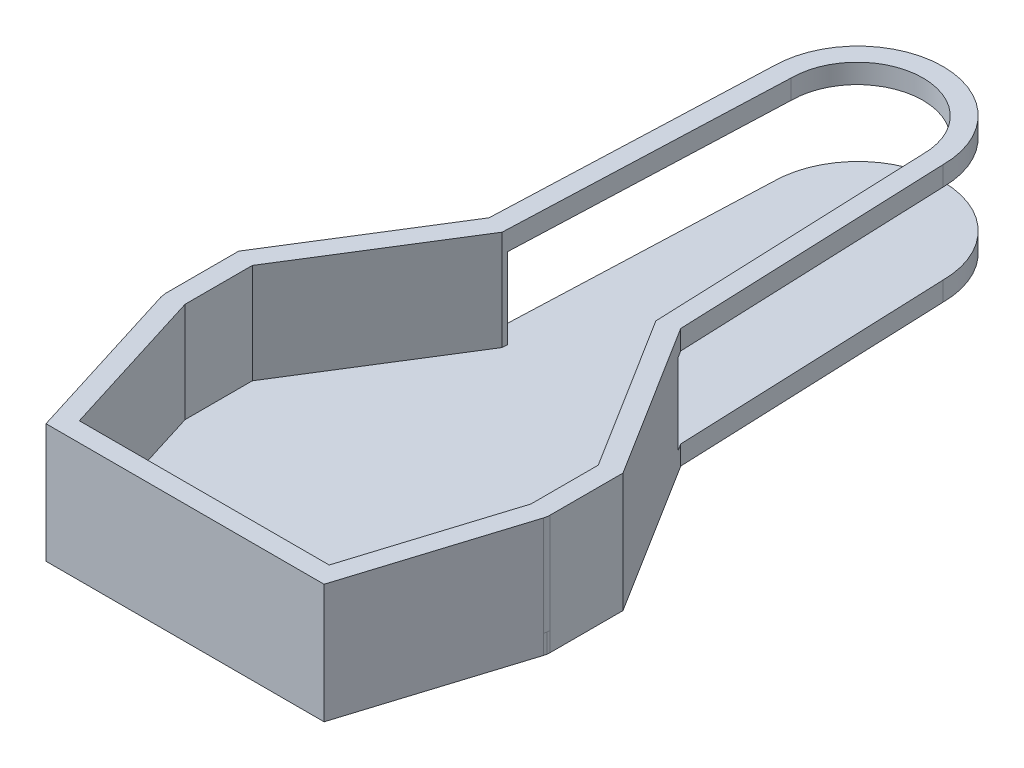
ISO-10303-21;
HEADER;
FILE_DESCRIPTION(('STEP AP214'),'2;1');
FILE_NAME('part.step','',(''),(''),'','','');
FILE_SCHEMA(('AUTOMOTIVE_DESIGN { 1 0 10303 214 1 1 1 1 }'));
ENDSEC;
DATA;
#1=APPLICATION_CONTEXT('core data for automotive mechanical design processes');
#2=APPLICATION_PROTOCOL_DEFINITION('international standard','automotive_design',2000,#1);
#3=PRODUCT_CONTEXT('',#1,'mechanical');
#4=PRODUCT('Part','Part','',(#3));
#5=PRODUCT_RELATED_PRODUCT_CATEGORY('part','',(#4));
#6=PRODUCT_DEFINITION_FORMATION('','',#4);
#7=PRODUCT_DEFINITION_CONTEXT('part definition',#1,'design');
#8=PRODUCT_DEFINITION('design','',#6,#7);
#9=PRODUCT_DEFINITION_SHAPE('','',#8);
#10=(LENGTH_UNIT() NAMED_UNIT(*) SI_UNIT(.MILLI.,.METRE.));
#11=(NAMED_UNIT(*) PLANE_ANGLE_UNIT() SI_UNIT($,.RADIAN.));
#12=(NAMED_UNIT(*) SI_UNIT($,.STERADIAN.) SOLID_ANGLE_UNIT());
#13=UNCERTAINTY_MEASURE_WITH_UNIT(LENGTH_MEASURE(1.E-05),#10,'distance_accuracy_value','');
#14=(GEOMETRIC_REPRESENTATION_CONTEXT(3) GLOBAL_UNCERTAINTY_ASSIGNED_CONTEXT((#13)) GLOBAL_UNIT_ASSIGNED_CONTEXT((#10,
#11,#12)) REPRESENTATION_CONTEXT('',''));
#15=CARTESIAN_POINT('',(0.,0.,0.));
#16=DIRECTION('',(0.,0.,1.));
#17=DIRECTION('',(1.,0.,0.));
#18=AXIS2_PLACEMENT_3D('',#15,#16,#17);
#19=CARTESIAN_POINT('',(41.2789167381474,33.02,-215.965853578591));
#20=DIRECTION('',(0.,-1.,0.));
#21=DIRECTION('',(0.,0.,-1.));
#22=AXIS2_PLACEMENT_3D('',#19,#20,#21);
#23=CYLINDRICAL_SURFACE('',#22,28.1239344626758);
#24=DIRECTION('',(0.,-1.,0.));
#25=VECTOR('',#24,1.);
#26=CARTESIAN_POINT('',(13.1549822754717,33.02,-215.965853578591));
#27=LINE('',#26,#25);
#28=CARTESIAN_POINT('',(13.1549822754717,0.,-215.965853578591));
#29=VERTEX_POINT('',#28);
#30=CARTESIAN_POINT('',(13.1549822754717,-6.35,-215.965853578591));
#31=VERTEX_POINT('',#30);
#32=EDGE_CURVE('E482',#29,#31,#27,.T.);
#33=ORIENTED_EDGE('',*,*,#32,.F.);
#34=CARTESIAN_POINT('',(41.2789167381474,0.,-215.965853578591));
#35=DIRECTION('',(0.,1.,0.));
#36=DIRECTION('',(0.,0.,1.));
#37=AXIS2_PLACEMENT_3D('',#34,#35,#36);
#38=CIRCLE('',#37,28.1239344626758);
#39=CARTESIAN_POINT('',(69.4028512008232,0.,-215.965853578591));
#40=VERTEX_POINT('',#39);
#41=EDGE_CURVE('E245',#29,#40,#38,.F.);
#42=ORIENTED_EDGE('',*,*,#41,.T.);
#43=DIRECTION('',(0.,-1.,0.));
#44=VECTOR('',#43,1.);
#45=CARTESIAN_POINT('',(69.4028512008232,33.02,-215.965853578591));
#46=LINE('',#45,#44);
#47=CARTESIAN_POINT('',(69.4028512008232,-6.35,-215.965853578591));
#48=VERTEX_POINT('',#47);
#49=EDGE_CURVE('E407',#40,#48,#46,.T.);
#50=ORIENTED_EDGE('',*,*,#49,.T.);
#51=CARTESIAN_POINT('',(41.2789167381474,-6.35,-215.965853578591));
#52=DIRECTION('',(0.,-1.,0.));
#53=DIRECTION('',(0.,0.,-1.));
#54=AXIS2_PLACEMENT_3D('',#51,#52,#53);
#55=CIRCLE('',#54,28.1239344626758);
#56=EDGE_CURVE('E325',#31,#48,#55,.T.);
#57=ORIENTED_EDGE('',*,*,#56,.F.);
#58=EDGE_LOOP('',(#33,#42,#50,#57));
#59=FACE_BOUND('',#58,.T.);
#60=ADVANCED_FACE('F35',(#59),#23,.T.);
#61=CARTESIAN_POINT('',(4.63721586896624,33.02,0.182738740625529));
#62=DIRECTION('',(-0.999224447545275,0.,-0.0393764323909659));
#63=DIRECTION('',(-0.0393764323909659,0.,0.999224447545275));
#64=AXIS2_PLACEMENT_3D('',#61,#62,#63);
#65=PLANE('',#64);
#66=DIRECTION('',(0.,-1.,0.));
#67=VECTOR('',#66,1.);
#68=CARTESIAN_POINT('',(9.60025223164843,33.02,-125.760292827314));
#69=LINE('',#68,#67);
#70=CARTESIAN_POINT('',(9.60025223164841,0.,-125.760292827313));
#71=VERTEX_POINT('',#70);
#72=CARTESIAN_POINT('',(9.60025223164845,-6.35,-125.760292827314));
#73=VERTEX_POINT('',#72);
#74=EDGE_CURVE('E259',#71,#73,#69,.T.);
#75=ORIENTED_EDGE('',*,*,#74,.F.);
#76=DIRECTION('',(0.0393764323909659,0.,-0.999224447545275));
#77=VECTOR('',#76,1.);
#78=CARTESIAN_POINT('',(4.63721586896624,0.,0.182738740625529));
#79=LINE('',#78,#77);
#80=EDGE_CURVE('E238',#71,#29,#79,.T.);
#81=ORIENTED_EDGE('',*,*,#80,.T.);
#82=ORIENTED_EDGE('',*,*,#32,.T.);
#83=DIRECTION('',(0.0393764323909659,0.,-0.999224447545275));
#84=VECTOR('',#83,1.);
#85=CARTESIAN_POINT('',(4.63721586896624,-6.35,0.182738740625529));
#86=LINE('',#85,#84);
#87=EDGE_CURVE('E262',#73,#31,#86,.T.);
#88=ORIENTED_EDGE('',*,*,#87,.F.);
#89=EDGE_LOOP('',(#75,#81,#82,#88));
#90=FACE_BOUND('',#89,.T.);
#91=ADVANCED_FACE('F260',(#90),#65,.T.);
#92=CARTESIAN_POINT('',(77.7926114035286,33.02,-3.06557301612554));
#93=DIRECTION('',(0.999224447545275,0.,-0.0393764323909661));
#94=DIRECTION('',(-0.0393764323909661,0.,-0.999224447545275));
#95=AXIS2_PLACEMENT_3D('',#92,#93,#94);
#96=PLANE('',#95);
#97=ORIENTED_EDGE('',*,*,#49,.F.);
#98=DIRECTION('',(0.0393764323909661,0.,0.999224447545275));
#99=VECTOR('',#98,1.);
#100=CARTESIAN_POINT('',(77.7926114035286,0.,-3.06557301612554));
#101=LINE('',#100,#99);
#102=CARTESIAN_POINT('',(72.9575812446464,0.,-125.760292827313));
#103=VERTEX_POINT('',#102);
#104=EDGE_CURVE('E276',#40,#103,#101,.T.);
#105=ORIENTED_EDGE('',*,*,#104,.T.);
#106=DIRECTION('',(0.,-1.,0.));
#107=VECTOR('',#106,1.);
#108=CARTESIAN_POINT('',(72.9575812446464,33.02,-125.760292827313));
#109=LINE('',#108,#107);
#110=CARTESIAN_POINT('',(72.9575812446464,-6.35,-125.760292827314));
#111=VERTEX_POINT('',#110);
#112=EDGE_CURVE('E462',#103,#111,#109,.T.);
#113=ORIENTED_EDGE('',*,*,#112,.T.);
#114=DIRECTION('',(0.0393764323909661,0.,0.999224447545275));
#115=VECTOR('',#114,1.);
#116=CARTESIAN_POINT('',(77.7926114035286,-6.35,-3.06557301612554));
#117=LINE('',#116,#115);
#118=EDGE_CURVE('E328',#48,#111,#117,.T.);
#119=ORIENTED_EDGE('',*,*,#118,.F.);
#120=EDGE_LOOP('',(#97,#105,#113,#119));
#121=FACE_BOUND('',#120,.T.);
#122=ADVANCED_FACE('F494',(#121),#96,.T.);
#123=CARTESIAN_POINT('',(0.,0.,0.));
#124=DIRECTION('',(0.,1.,0.));
#125=DIRECTION('',(0.,0.,1.));
#126=AXIS2_PLACEMENT_3D('',#123,#124,#125);
#127=PLANE('',#126);
#128=CARTESIAN_POINT('',(98.4289167381475,0.,-50.8));
#129=DIRECTION('',(0.,1.,0.));
#130=DIRECTION('',(0.,0.,1.));
#131=AXIS2_PLACEMENT_3D('',#128,#129,#130);
#132=CIRCLE('',#131,6.34999999999993);
#133=CARTESIAN_POINT('',(104.706204131141,0.,-49.8417917837094));
#134=VERTEX_POINT('',#133);
#135=CARTESIAN_POINT('',(104.778916738147,0.,-50.8));
#136=VERTEX_POINT('',#135);
#137=EDGE_CURVE('E347',#134,#136,#132,.T.);
#138=ORIENTED_EDGE('',*,*,#137,.F.);
#139=DIRECTION('',(0.0756663870322042,0.,-0.997133189635915));
#140=VECTOR('',#139,1.);
#141=CARTESIAN_POINT('',(100.34618244028,0.,7.61466287217133));
#142=LINE('',#141,#140);
#143=EDGE_CURVE('E299',#134,#136,#142,.T.);
#144=ORIENTED_EDGE('',*,*,#143,.T.);
#145=EDGE_LOOP('',(#138,#144));
#146=FACE_BOUND('',#145,.T.);
#147=ADVANCED_FACE('F595',(#146),#127,.F.);
#148=CARTESIAN_POINT('',(41.2789167381474,33.02,-215.715813232908));
#149=DIRECTION('',(0.,-1.,0.));
#150=DIRECTION('',(0.,0.,-1.));
#151=AXIS2_PLACEMENT_3D('',#148,#149,#150);
#152=CYLINDRICAL_SURFACE('',#151,21.7788592207633);
#153=CARTESIAN_POINT('',(41.2789167381474,26.5966989995721,-215.715813232908));
#154=DIRECTION('',(0.,1.,0.));
#155=DIRECTION('',(0.,0.,1.));
#156=AXIS2_PLACEMENT_3D('',#153,#154,#155);
#157=CIRCLE('',#156,21.7788592207633);
#158=CARTESIAN_POINT('',(63.0577759589107,26.5966989995721,-215.715813232908));
#159=VERTEX_POINT('',#158);
#160=CARTESIAN_POINT('',(19.5000575173842,26.5966989995721,-215.715813232908));
#161=VERTEX_POINT('',#160);
#162=EDGE_CURVE('E249',#159,#161,#157,.T.);
#163=ORIENTED_EDGE('',*,*,#162,.F.);
#164=DIRECTION('',(0.,-1.,0.));
#165=VECTOR('',#164,1.);
#166=CARTESIAN_POINT('',(63.0577759589107,33.02,-215.715813232908));
#167=LINE('',#166,#165);
#168=CARTESIAN_POINT('',(63.0577759589107,33.02,-215.715813232908));
#169=VERTEX_POINT('',#168);
#170=EDGE_CURVE('E43',#169,#159,#167,.T.);
#171=ORIENTED_EDGE('',*,*,#170,.F.);
#172=CARTESIAN_POINT('',(41.2789167381474,33.02,-215.715813232908));
#173=DIRECTION('',(0.,1.,0.));
#174=DIRECTION('',(0.,0.,1.));
#175=AXIS2_PLACEMENT_3D('',#172,#173,#174);
#176=CIRCLE('',#175,21.7788592207633);
#177=CARTESIAN_POINT('',(19.5000575173842,33.02,-215.715813232908));
#178=VERTEX_POINT('',#177);
#179=EDGE_CURVE('E379',#169,#178,#176,.T.);
#180=ORIENTED_EDGE('',*,*,#179,.T.);
#181=DIRECTION('',(0.,-1.,0.));
#182=VECTOR('',#181,1.);
#183=CARTESIAN_POINT('',(19.5000575173842,33.02,-215.715813232908));
#184=LINE('',#183,#182);
#185=EDGE_CURVE('E429',#178,#161,#184,.T.);
#186=ORIENTED_EDGE('',*,*,#185,.T.);
#187=EDGE_LOOP('',(#163,#171,#180,#186));
#188=FACE_BOUND('',#187,.T.);
#189=ADVANCED_FACE('F593',(#188),#152,.F.);
#190=CARTESIAN_POINT('',(71.4475361616161,33.02,-2.8155326704429));
#191=DIRECTION('',(0.999224447545275,0.,-0.0393764323909661));
#192=DIRECTION('',(-0.0393764323909661,0.,-0.999224447545275));
#193=AXIS2_PLACEMENT_3D('',#190,#191,#192);
#194=PLANE('',#193);
#195=ORIENTED_EDGE('',*,*,#170,.T.);
#196=DIRECTION('',(0.0393764323909661,0.,0.999224447545275));
#197=VECTOR('',#196,1.);
#198=CARTESIAN_POINT('',(71.4475361616161,26.5966989995721,-2.8155326704429));
#199=LINE('',#198,#197);
#200=CARTESIAN_POINT('',(66.6789167381474,26.5966989995721,-123.825));
#201=VERTEX_POINT('',#200);
#202=EDGE_CURVE('E285',#159,#201,#199,.T.);
#203=ORIENTED_EDGE('',*,*,#202,.T.);
#204=DIRECTION('',(0.,-1.,0.));
#205=VECTOR('',#204,1.);
#206=CARTESIAN_POINT('',(66.6789167381474,33.02,-123.825));
#207=LINE('',#206,#205);
#208=CARTESIAN_POINT('',(66.6789167381474,33.02,-123.825));
#209=VERTEX_POINT('',#208);
#210=EDGE_CURVE('E454',#209,#201,#207,.T.);
#211=ORIENTED_EDGE('',*,*,#210,.F.);
#212=DIRECTION('',(0.0393764323909661,0.,0.999224447545275));
#213=VECTOR('',#212,1.);
#214=CARTESIAN_POINT('',(71.4475361616161,33.02,-2.8155326704429));
#215=LINE('',#214,#213);
#216=EDGE_CURVE('E382',#169,#209,#215,.T.);
#217=ORIENTED_EDGE('',*,*,#216,.F.);
#218=EDGE_LOOP('',(#195,#203,#211,#217));
#219=FACE_BOUND('',#218,.T.);
#220=ADVANCED_FACE('F565',(#219),#194,.F.);
#221=CARTESIAN_POINT('',(103.600569339791,33.02,-64.7503558373697));
#222=DIRECTION('',(-0.847998304005088,0.,0.52999894000318));
#223=DIRECTION('',(0.52999894000318,0.,0.847998304005088));
#224=AXIS2_PLACEMENT_3D('',#221,#222,#223);
#225=PLANE('',#224);
#226=DIRECTION('',(-0.52999894000318,0.,-0.847998304005088));
#227=VECTOR('',#226,1.);
#228=CARTESIAN_POINT('',(103.600569339791,26.5966989995721,-64.7503558373697));
#229=LINE('',#228,#227);
#230=CARTESIAN_POINT('',(66.8801260185759,26.5966989995721,-123.503065151314));
#231=VERTEX_POINT('',#230);
#232=EDGE_CURVE('E288',#231,#201,#229,.T.);
#233=ORIENTED_EDGE('',*,*,#232,.F.);
#234=DIRECTION('',(0.,-1.,0.));
#235=VECTOR('',#234,1.);
#236=CARTESIAN_POINT('',(66.8801260185759,33.02,-123.503065151314));
#237=LINE('',#236,#235);
#238=CARTESIAN_POINT('',(66.8801260185759,0.,-123.503065151314));
#239=VERTEX_POINT('',#238);
#240=EDGE_CURVE('E272',#231,#239,#237,.T.);
#241=ORIENTED_EDGE('',*,*,#240,.T.);
#242=DIRECTION('',(-0.52999894000318,0.,-0.847998304005088));
#243=VECTOR('',#242,1.);
#244=CARTESIAN_POINT('',(103.600569339791,0.,-64.7503558373697));
#245=LINE('',#244,#243);
#246=CARTESIAN_POINT('',(98.4289167381474,0.,-73.025));
#247=VERTEX_POINT('',#246);
#248=EDGE_CURVE('E411',#247,#239,#245,.T.);
#249=ORIENTED_EDGE('',*,*,#248,.F.);
#250=DIRECTION('',(0.,-1.,0.));
#251=VECTOR('',#250,1.);
#252=CARTESIAN_POINT('',(98.4289167381474,33.02,-73.025));
#253=LINE('',#252,#251);
#254=CARTESIAN_POINT('',(98.4289167381474,33.02,-73.025));
#255=VERTEX_POINT('',#254);
#256=EDGE_CURVE('E451',#255,#247,#253,.T.);
#257=ORIENTED_EDGE('',*,*,#256,.F.);
#258=DIRECTION('',(-0.52999894000318,0.,-0.847998304005088));
#259=VECTOR('',#258,1.);
#260=CARTESIAN_POINT('',(103.600569339791,33.02,-64.7503558373697));
#261=LINE('',#260,#259);
#262=EDGE_CURVE('E384',#255,#209,#261,.T.);
#263=ORIENTED_EDGE('',*,*,#262,.T.);
#264=ORIENTED_EDGE('',*,*,#210,.T.);
#265=EDGE_LOOP('',(#233,#241,#249,#257,#263,#264));
#266=FACE_BOUND('',#265,.T.);
#267=ADVANCED_FACE('F560',(#266),#225,.T.);
#268=CARTESIAN_POINT('',(98.4289167381474,33.02,0.));
#269=DIRECTION('',(-1.,0.,0.));
#270=DIRECTION('',(0.,0.,1.));
#271=AXIS2_PLACEMENT_3D('',#268,#269,#270);
#272=PLANE('',#271);
#273=DIRECTION('',(0.,0.,-1.));
#274=VECTOR('',#273,1.);
#275=CARTESIAN_POINT('',(98.4289167381474,0.,0.));
#276=LINE('',#275,#274);
#277=CARTESIAN_POINT('',(98.4289167381474,0.,-50.8));
#278=VERTEX_POINT('',#277);
#279=EDGE_CURVE('E413',#278,#247,#276,.T.);
#280=ORIENTED_EDGE('',*,*,#279,.F.);
#281=DIRECTION('',(0.,-1.,0.));
#282=VECTOR('',#281,1.);
#283=CARTESIAN_POINT('',(98.4289167381474,33.02,-50.8));
#284=LINE('',#283,#282);
#285=CARTESIAN_POINT('',(98.4289167381474,33.02,-50.8));
#286=VERTEX_POINT('',#285);
#287=EDGE_CURVE('E448',#286,#278,#284,.T.);
#288=ORIENTED_EDGE('',*,*,#287,.F.);
#289=DIRECTION('',(0.,0.,-1.));
#290=VECTOR('',#289,1.);
#291=CARTESIAN_POINT('',(98.4289167381474,33.02,0.));
#292=LINE('',#291,#290);
#293=EDGE_CURVE('E387',#286,#255,#292,.T.);
#294=ORIENTED_EDGE('',*,*,#293,.T.);
#295=ORIENTED_EDGE('',*,*,#256,.T.);
#296=EDGE_LOOP('',(#280,#288,#294,#295));
#297=FACE_BOUND('',#296,.T.);
#298=ADVANCED_FACE('F571',(#297),#272,.T.);
#299=CARTESIAN_POINT('',(75.2023920821158,33.02,23.50654571617));
#300=DIRECTION('',(-0.954459024824025,0.,-0.298342035140829));
#301=DIRECTION('',(-0.298342035140829,0.,0.954459024824025));
#302=AXIS2_PLACEMENT_3D('',#299,#300,#301);
#303=PLANE('',#302);
#304=DIRECTION('',(0.298342035140829,0.,-0.954459024824025));
#305=VECTOR('',#304,1.);
#306=CARTESIAN_POINT('',(75.2023920821158,0.,23.50654571617));
#307=LINE('',#306,#305);
#308=CARTESIAN_POINT('',(82.55,0.,0.));
#309=VERTEX_POINT('',#308);
#310=EDGE_CURVE('E415',#309,#278,#307,.T.);
#311=ORIENTED_EDGE('',*,*,#310,.F.);
#312=DIRECTION('',(0.,-1.,0.));
#313=VECTOR('',#312,1.);
#314=CARTESIAN_POINT('',(82.55,33.02,0.));
#315=LINE('',#314,#313);
#316=CARTESIAN_POINT('',(82.55,33.02,0.));
#317=VERTEX_POINT('',#316);
#318=EDGE_CURVE('E445',#317,#309,#315,.T.);
#319=ORIENTED_EDGE('',*,*,#318,.F.);
#320=DIRECTION('',(0.298342035140829,0.,-0.954459024824025));
#321=VECTOR('',#320,1.);
#322=CARTESIAN_POINT('',(75.2023920821158,33.02,23.50654571617));
#323=LINE('',#322,#321);
#324=EDGE_CURVE('E390',#317,#286,#323,.T.);
#325=ORIENTED_EDGE('',*,*,#324,.T.);
#326=ORIENTED_EDGE('',*,*,#287,.T.);
#327=EDGE_LOOP('',(#311,#319,#325,#326));
#328=FACE_BOUND('',#327,.T.);
#329=ADVANCED_FACE('F574',(#328),#303,.T.);
#330=CARTESIAN_POINT('',(0.,33.02,0.));
#331=DIRECTION('',(0.,0.,-1.));
#332=DIRECTION('',(-1.,0.,0.));
#333=AXIS2_PLACEMENT_3D('',#330,#331,#332);
#334=PLANE('',#333);
#335=DIRECTION('',(1.,0.,0.));
#336=VECTOR('',#335,1.);
#337=CARTESIAN_POINT('',(0.,0.,0.));
#338=LINE('',#337,#336);
#339=CARTESIAN_POINT('',(0.,0.,0.));
#340=VERTEX_POINT('',#339);
#341=EDGE_CURVE('E417',#340,#309,#338,.T.);
#342=ORIENTED_EDGE('',*,*,#341,.F.);
#343=DIRECTION('',(0.,-1.,0.));
#344=VECTOR('',#343,1.);
#345=CARTESIAN_POINT('',(0.,33.02,0.));
#346=LINE('',#345,#344);
#347=CARTESIAN_POINT('',(0.,33.02,0.));
#348=VERTEX_POINT('',#347);
#349=EDGE_CURVE('E442',#348,#340,#346,.T.);
#350=ORIENTED_EDGE('',*,*,#349,.F.);
#351=DIRECTION('',(1.,0.,0.));
#352=VECTOR('',#351,1.);
#353=CARTESIAN_POINT('',(0.,33.02,0.));
#354=LINE('',#353,#352);
#355=EDGE_CURVE('E393',#348,#317,#354,.T.);
#356=ORIENTED_EDGE('',*,*,#355,.T.);
#357=ORIENTED_EDGE('',*,*,#318,.T.);
#358=EDGE_LOOP('',(#342,#350,#356,#357));
#359=FACE_BOUND('',#358,.T.);
#360=ADVANCED_FACE('F578',(#359),#334,.T.);
#361=CARTESIAN_POINT('',(0.,33.02,0.));
#362=DIRECTION('',(-0.954500927456525,0.,0.298207946716102));
#363=DIRECTION('',(0.298207946716102,0.,0.954500927456525));
#364=AXIS2_PLACEMENT_3D('',#361,#362,#363);
#365=PLANE('',#364);
#366=DIRECTION('',(-0.298207946716102,0.,-0.954500927456525));
#367=VECTOR('',#366,1.);
#368=CARTESIAN_POINT('',(0.,0.,0.));
#369=LINE('',#368,#367);
#370=CARTESIAN_POINT('',(-15.8710832618526,0.,-50.8));
#371=VERTEX_POINT('',#370);
#372=EDGE_CURVE('E419',#340,#371,#369,.T.);
#373=ORIENTED_EDGE('',*,*,#372,.T.);
#374=DIRECTION('',(0.,-1.,0.));
#375=VECTOR('',#374,1.);
#376=CARTESIAN_POINT('',(-15.8710832618526,33.02,-50.8));
#377=LINE('',#376,#375);
#378=CARTESIAN_POINT('',(-15.8710832618526,33.02,-50.8));
#379=VERTEX_POINT('',#378);
#380=EDGE_CURVE('E439',#379,#371,#377,.T.);
#381=ORIENTED_EDGE('',*,*,#380,.F.);
#382=DIRECTION('',(-0.298207946716102,0.,-0.954500927456525));
#383=VECTOR('',#382,1.);
#384=CARTESIAN_POINT('',(0.,33.02,0.));
#385=LINE('',#384,#383);
#386=EDGE_CURVE('E396',#348,#379,#385,.T.);
#387=ORIENTED_EDGE('',*,*,#386,.F.);
#388=ORIENTED_EDGE('',*,*,#349,.T.);
#389=EDGE_LOOP('',(#373,#381,#387,#388));
#390=FACE_BOUND('',#389,.T.);
#391=ADVANCED_FACE('F582',(#390),#365,.F.);
#392=CARTESIAN_POINT('',(-15.8710832618526,33.02,0.));
#393=DIRECTION('',(-1.,0.,0.));
#394=DIRECTION('',(0.,0.,1.));
#395=AXIS2_PLACEMENT_3D('',#392,#393,#394);
#396=PLANE('',#395);
#397=DIRECTION('',(0.,0.,-1.));
#398=VECTOR('',#397,1.);
#399=CARTESIAN_POINT('',(-15.8710832618526,0.,0.));
#400=LINE('',#399,#398);
#401=CARTESIAN_POINT('',(-15.8710832618526,0.,-73.025));
#402=VERTEX_POINT('',#401);
#403=EDGE_CURVE('E422',#371,#402,#400,.T.);
#404=ORIENTED_EDGE('',*,*,#403,.T.);
#405=DIRECTION('',(0.,-1.,0.));
#406=VECTOR('',#405,1.);
#407=CARTESIAN_POINT('',(-15.8710832618526,33.02,-73.025));
#408=LINE('',#407,#406);
#409=CARTESIAN_POINT('',(-15.8710832618526,33.02,-73.025));
#410=VERTEX_POINT('',#409);
#411=EDGE_CURVE('E436',#410,#402,#408,.T.);
#412=ORIENTED_EDGE('',*,*,#411,.F.);
#413=DIRECTION('',(0.,0.,-1.));
#414=VECTOR('',#413,1.);
#415=CARTESIAN_POINT('',(-15.8710832618526,33.02,0.));
#416=LINE('',#415,#414);
#417=EDGE_CURVE('E399',#379,#410,#416,.T.);
#418=ORIENTED_EDGE('',*,*,#417,.F.);
#419=ORIENTED_EDGE('',*,*,#380,.T.);
#420=EDGE_LOOP('',(#404,#412,#418,#419));
#421=FACE_BOUND('',#420,.T.);
#422=ADVANCED_FACE('F586',(#421),#396,.F.);
#423=CARTESIAN_POINT('',(-44.2331385253771,33.02,-27.6457115783607));
#424=DIRECTION('',(-0.847998304005088,0.,-0.52999894000318));
#425=DIRECTION('',(-0.52999894000318,0.,0.847998304005088));
#426=AXIS2_PLACEMENT_3D('',#423,#424,#425);
#427=PLANE('',#426);
#428=DIRECTION('',(0.52999894000318,0.,-0.847998304005088));
#429=VECTOR('',#428,1.);
#430=CARTESIAN_POINT('',(-44.2331385253771,0.,-27.6457115783607));
#431=LINE('',#430,#429);
#432=CARTESIAN_POINT('',(15.8789167381474,0.,-123.825));
#433=VERTEX_POINT('',#432);
#434=EDGE_CURVE('E425',#402,#433,#431,.T.);
#435=ORIENTED_EDGE('',*,*,#434,.T.);
#436=DIRECTION('',(0.,-1.,0.));
#437=VECTOR('',#436,1.);
#438=CARTESIAN_POINT('',(15.8789167381474,33.02,-123.825));
#439=LINE('',#438,#437);
#440=CARTESIAN_POINT('',(15.8789167381474,33.02,-123.825));
#441=VERTEX_POINT('',#440);
#442=EDGE_CURVE('E432',#441,#433,#439,.T.);
#443=ORIENTED_EDGE('',*,*,#442,.F.);
#444=DIRECTION('',(0.52999894000318,0.,-0.847998304005088));
#445=VECTOR('',#444,1.);
#446=CARTESIAN_POINT('',(-44.2331385253771,33.02,-27.6457115783607));
#447=LINE('',#446,#445);
#448=EDGE_CURVE('E402',#410,#441,#447,.T.);
#449=ORIENTED_EDGE('',*,*,#448,.F.);
#450=ORIENTED_EDGE('',*,*,#411,.T.);
#451=EDGE_LOOP('',(#435,#443,#449,#450));
#452=FACE_BOUND('',#451,.T.);
#453=ADVANCED_FACE('F588',(#452),#427,.F.);
#454=CARTESIAN_POINT('',(41.2789167381474,26.5966989995721,-215.965853578591));
#455=DIRECTION('',(0.,1.,0.));
#456=DIRECTION('',(0.,0.,1.));
#457=AXIS2_PLACEMENT_3D('',#454,#455,#456);
#458=CIRCLE('',#457,28.1239344626758);
#459=CARTESIAN_POINT('',(13.1549822754717,26.5966989995721,-215.965853578591));
#460=VERTEX_POINT('',#459);
#461=CARTESIAN_POINT('',(69.4028512008232,26.5966989995721,-215.965853578591));
#462=VERTEX_POINT('',#461);
#463=EDGE_CURVE('E295',#460,#462,#458,.F.);
#464=ORIENTED_EDGE('',*,*,#463,.F.);
#465=CARTESIAN_POINT('',(13.1549822754717,33.02,-215.965853578591));
#466=VERTEX_POINT('',#465);
#467=EDGE_CURVE('E433',#466,#460,#27,.T.);
#468=ORIENTED_EDGE('',*,*,#467,.F.);
#469=CARTESIAN_POINT('',(41.2789167381474,33.02,-215.965853578591));
#470=DIRECTION('',(0.,1.,0.));
#471=DIRECTION('',(0.,0.,1.));
#472=AXIS2_PLACEMENT_3D('',#469,#470,#471);
#473=CIRCLE('',#472,28.1239344626758);
#474=CARTESIAN_POINT('',(69.4028512008232,33.02,-215.965853578591));
#475=VERTEX_POINT('',#474);
#476=EDGE_CURVE('E348',#466,#475,#473,.F.);
#477=ORIENTED_EDGE('',*,*,#476,.T.);
#478=EDGE_CURVE('E459',#475,#462,#46,.T.);
#479=ORIENTED_EDGE('',*,*,#478,.T.);
#480=EDGE_LOOP('',(#464,#468,#477,#479));
#481=FACE_BOUND('',#480,.T.);
#482=ADVANCED_FACE('F37',(#481),#23,.T.);
#483=DIRECTION('',(0.0393764323909659,0.,-0.999224447545275));
#484=VECTOR('',#483,1.);
#485=CARTESIAN_POINT('',(4.63721586896624,26.5966989995721,0.182738740625529));
#486=LINE('',#485,#484);
#487=CARTESIAN_POINT('',(9.60025223164841,26.5966989995721,-125.760292827313));
#488=VERTEX_POINT('',#487);
#489=EDGE_CURVE('E297',#488,#460,#486,.T.);
#490=ORIENTED_EDGE('',*,*,#489,.F.);
#491=CARTESIAN_POINT('',(9.60025223164843,33.02,-125.760292827314));
#492=VERTEX_POINT('',#491);
#493=EDGE_CURVE('E266',#492,#488,#69,.T.);
#494=ORIENTED_EDGE('',*,*,#493,.F.);
#495=DIRECTION('',(0.0393764323909659,0.,-0.999224447545275));
#496=VECTOR('',#495,1.);
#497=CARTESIAN_POINT('',(4.63721586896624,33.02,0.182738740625529));
#498=LINE('',#497,#496);
#499=EDGE_CURVE('E351',#492,#466,#498,.T.);
#500=ORIENTED_EDGE('',*,*,#499,.T.);
#501=ORIENTED_EDGE('',*,*,#467,.T.);
#502=EDGE_LOOP('',(#490,#494,#500,#501));
#503=FACE_BOUND('',#502,.T.);
#504=ADVANCED_FACE('F542',(#503),#65,.T.);
#505=CARTESIAN_POINT('',(-49.6179277558094,33.02,-31.0112048473809));
#506=DIRECTION('',(-0.847998304005088,0.,-0.52999894000318));
#507=DIRECTION('',(-0.52999894000318,0.,0.847998304005088));
#508=AXIS2_PLACEMENT_3D('',#505,#506,#507);
#509=PLANE('',#508);
#510=ORIENTED_EDGE('',*,*,#493,.T.);
#511=DIRECTION('',(0.,-1.,0.));
#512=VECTOR('',#511,1.);
#513=CARTESIAN_POINT('',(9.6002522316484,33.02,-125.760292827313));
#514=LINE('',#513,#512);
#515=EDGE_CURVE('E253',#488,#71,#514,.T.);
#516=ORIENTED_EDGE('',*,*,#515,.T.);
#517=ORIENTED_EDGE('',*,*,#74,.T.);
#518=DIRECTION('',(0.52999894000318,0.,-0.847998304005088));
#519=VECTOR('',#518,1.);
#520=CARTESIAN_POINT('',(-49.6179277558094,-6.35,-31.0112048473809));
#521=LINE('',#520,#519);
#522=CARTESIAN_POINT('',(-22.2210832618526,-6.35,-74.8461560377119));
#523=VERTEX_POINT('',#522);
#524=EDGE_CURVE('E322',#523,#73,#521,.T.);
#525=ORIENTED_EDGE('',*,*,#524,.F.);
#526=DIRECTION('',(0.,-1.,0.));
#527=VECTOR('',#526,1.);
#528=CARTESIAN_POINT('',(-22.2210832618526,33.02,-74.8461560377119));
#529=LINE('',#528,#527);
#530=CARTESIAN_POINT('',(-22.2210832618526,33.02,-74.8461560377119));
#531=VERTEX_POINT('',#530);
#532=EDGE_CURVE('E267',#531,#523,#529,.T.);
#533=ORIENTED_EDGE('',*,*,#532,.F.);
#534=DIRECTION('',(0.52999894000318,0.,-0.847998304005088));
#535=VECTOR('',#534,1.);
#536=CARTESIAN_POINT('',(-49.6179277558094,33.02,-31.0112048473809));
#537=LINE('',#536,#535);
#538=EDGE_CURVE('E355',#531,#492,#537,.T.);
#539=ORIENTED_EDGE('',*,*,#538,.T.);
#540=EDGE_LOOP('',(#510,#516,#517,#525,#533,#539));
#541=FACE_BOUND('',#540,.T.);
#542=ADVANCED_FACE('F270',(#541),#509,.T.);
#543=CARTESIAN_POINT('',(-22.2210832618526,33.02,0.));
#544=DIRECTION('',(-1.,0.,0.));
#545=DIRECTION('',(0.,0.,1.));
#546=AXIS2_PLACEMENT_3D('',#543,#544,#545);
#547=PLANE('',#546);
#548=ORIENTED_EDGE('',*,*,#532,.T.);
#549=DIRECTION('',(0.,0.,-1.));
#550=VECTOR('',#549,1.);
#551=CARTESIAN_POINT('',(-22.2210832618526,-6.35,0.));
#552=LINE('',#551,#550);
#553=CARTESIAN_POINT('',(-22.2210832618526,-6.35,-50.8));
#554=VERTEX_POINT('',#553);
#555=EDGE_CURVE('E319',#554,#523,#552,.T.);
#556=ORIENTED_EDGE('',*,*,#555,.F.);
#557=DIRECTION('',(0.,-1.,0.));
#558=VECTOR('',#557,1.);
#559=CARTESIAN_POINT('',(-22.2210832618526,33.02,-50.8));
#560=LINE('',#559,#558);
#561=CARTESIAN_POINT('',(-22.2210832618526,33.02,-50.8));
#562=VERTEX_POINT('',#561);
#563=EDGE_CURVE('E480',#562,#554,#560,.T.);
#564=ORIENTED_EDGE('',*,*,#563,.F.);
#565=DIRECTION('',(0.,0.,-1.));
#566=VECTOR('',#565,1.);
#567=CARTESIAN_POINT('',(-22.2210832618526,33.02,0.));
#568=LINE('',#567,#566);
#569=EDGE_CURVE('E357',#562,#531,#568,.T.);
#570=ORIENTED_EDGE('',*,*,#569,.T.);
#571=EDGE_LOOP('',(#548,#556,#564,#570));
#572=FACE_BOUND('',#571,.T.);
#573=ADVANCED_FACE('F534',(#572),#547,.T.);
#574=CARTESIAN_POINT('',(-14.1410820756008,33.02,2.15757536405803));
#575=DIRECTION('',(-0.988559792692512,0.,0.150829494037927));
#576=DIRECTION('',(0.150829494037927,0.,0.988559792692512));
#577=AXIS2_PLACEMENT_3D('',#574,#575,#576);
#578=PLANE('',#577);
#579=ORIENTED_EDGE('',*,*,#563,.T.);
#580=DIRECTION('',(-0.150829494037927,0.,-0.988559792692512));
#581=VECTOR('',#580,1.);
#582=CARTESIAN_POINT('',(-14.1410820756008,-6.35,2.15757536405803));
#583=LINE('',#582,#581);
#584=CARTESIAN_POINT('',(-21.9321641512015,-6.35,-48.9063795383528));
#585=VERTEX_POINT('',#584);
#586=EDGE_CURVE('E316',#585,#554,#583,.T.);
#587=ORIENTED_EDGE('',*,*,#586,.F.);
#588=DIRECTION('',(0.,-1.,0.));
#589=VECTOR('',#588,1.);
#590=CARTESIAN_POINT('',(-21.9321641512015,33.02,-48.9063795383528));
#591=LINE('',#590,#589);
#592=CARTESIAN_POINT('',(-21.9321641512015,33.02,-48.9063795383528));
#593=VERTEX_POINT('',#592);
#594=EDGE_CURVE('E478',#593,#585,#591,.T.);
#595=ORIENTED_EDGE('',*,*,#594,.F.);
#596=DIRECTION('',(-0.150829494037927,0.,-0.988559792692512));
#597=VECTOR('',#596,1.);
#598=CARTESIAN_POINT('',(-14.1410820756008,33.02,2.15757536405803));
#599=LINE('',#598,#597);
#600=EDGE_CURVE('E360',#593,#562,#599,.T.);
#601=ORIENTED_EDGE('',*,*,#600,.T.);
#602=EDGE_LOOP('',(#579,#587,#595,#601));
#603=FACE_BOUND('',#602,.T.);
#604=ADVANCED_FACE('F530',(#603),#578,.T.);
#605=CARTESIAN_POINT('',(-6.06108088934894,33.02,1.89362046164725));
#606=DIRECTION('',(-0.954500927456525,0.,0.298207946716102));
#607=DIRECTION('',(0.298207946716102,0.,0.954500927456525));
#608=AXIS2_PLACEMENT_3D('',#605,#606,#607);
#609=PLANE('',#608);
#610=ORIENTED_EDGE('',*,*,#594,.T.);
#611=DIRECTION('',(-0.298207946716102,0.,-0.954500927456525));
#612=VECTOR('',#611,1.);
#613=CARTESIAN_POINT('',(-6.06108088934894,-6.35,1.89362046164725));
#614=LINE('',#613,#612);
#615=CARTESIAN_POINT('',(-4.66880587557704,-6.35,6.35));
#616=VERTEX_POINT('',#615);
#617=EDGE_CURVE('E313',#616,#585,#614,.T.);
#618=ORIENTED_EDGE('',*,*,#617,.F.);
#619=DIRECTION('',(0.,-1.,0.));
#620=VECTOR('',#619,1.);
#621=CARTESIAN_POINT('',(-4.66880587557704,33.02,6.35));
#622=LINE('',#621,#620);
#623=CARTESIAN_POINT('',(-4.66880587557704,33.02,6.35));
#624=VERTEX_POINT('',#623);
#625=EDGE_CURVE('E476',#624,#616,#622,.T.);
#626=ORIENTED_EDGE('',*,*,#625,.F.);
#627=DIRECTION('',(-0.298207946716102,0.,-0.954500927456525));
#628=VECTOR('',#627,1.);
#629=CARTESIAN_POINT('',(-6.06108088934894,33.02,1.89362046164725));
#630=LINE('',#629,#628);
#631=EDGE_CURVE('E363',#624,#593,#630,.T.);
#632=ORIENTED_EDGE('',*,*,#631,.T.);
#633=EDGE_LOOP('',(#610,#618,#626,#632));
#634=FACE_BOUND('',#633,.T.);
#635=ADVANCED_FACE('F526',(#634),#609,.T.);
#636=CARTESIAN_POINT('',(0.,33.02,6.35));
#637=DIRECTION('',(0.,0.,-1.));
#638=DIRECTION('',(-1.,0.,0.));
#639=AXIS2_PLACEMENT_3D('',#636,#637,#638);
#640=PLANE('',#639);
#641=ORIENTED_EDGE('',*,*,#625,.T.);
#642=DIRECTION('',(-1.,0.,0.));
#643=VECTOR('',#642,1.);
#644=CARTESIAN_POINT('',(0.,-6.35,6.35));
#645=LINE('',#644,#643);
#646=CARTESIAN_POINT('',(87.2181187573005,-6.35,6.35));
#647=VERTEX_POINT('',#646);
#648=EDGE_CURVE('E310',#647,#616,#645,.T.);
#649=ORIENTED_EDGE('',*,*,#648,.F.);
#650=DIRECTION('',(0.,-1.,0.));
#651=VECTOR('',#650,1.);
#652=CARTESIAN_POINT('',(87.2181187573005,33.02,6.35));
#653=LINE('',#652,#651);
#654=CARTESIAN_POINT('',(87.2181187573005,33.02,6.35));
#655=VERTEX_POINT('',#654);
#656=EDGE_CURVE('E474',#655,#647,#653,.T.);
#657=ORIENTED_EDGE('',*,*,#656,.F.);
#658=DIRECTION('',(1.,0.,0.));
#659=VECTOR('',#658,1.);
#660=CARTESIAN_POINT('',(0.,33.02,6.35));
#661=LINE('',#660,#659);
#662=EDGE_CURVE('E366',#624,#655,#661,.T.);
#663=ORIENTED_EDGE('',*,*,#662,.F.);
#664=EDGE_LOOP('',(#641,#649,#657,#663));
#665=FACE_BOUND('',#664,.T.);
#666=ADVANCED_FACE('F522',(#665),#640,.F.);
#667=CARTESIAN_POINT('',(81.2632068897483,33.02,25.4010176393142));
#668=DIRECTION('',(-0.954459024824025,0.,-0.298342035140829));
#669=DIRECTION('',(-0.298342035140829,0.,0.954459024824025));
#670=AXIS2_PLACEMENT_3D('',#667,#668,#669);
#671=PLANE('',#670);
#672=ORIENTED_EDGE('',*,*,#656,.T.);
#673=DIRECTION('',(-0.298342035140829,0.,0.954459024824025));
#674=VECTOR('',#673,1.);
#675=CARTESIAN_POINT('',(81.2632068897483,-6.35,25.4010176393142));
#676=LINE('',#675,#674);
#677=CARTESIAN_POINT('',(104.48973154578,-6.35,-48.9055280768557));
#678=VERTEX_POINT('',#677);
#679=EDGE_CURVE('E307',#678,#647,#676,.T.);
#680=ORIENTED_EDGE('',*,*,#679,.F.);
#681=DIRECTION('',(0.,1.,0.));
#682=VECTOR('',#681,1.);
#683=CARTESIAN_POINT('',(104.48973154578,-6.35,-48.9055280768557));
#684=LINE('',#683,#682);
#685=CARTESIAN_POINT('',(104.48973154578,0.,-48.9055280768557));
#686=VERTEX_POINT('',#685);
#687=EDGE_CURVE('E342',#678,#686,#684,.T.);
#688=ORIENTED_EDGE('',*,*,#687,.T.);
#689=DIRECTION('',(0.,-1.,0.));
#690=VECTOR('',#689,1.);
#691=CARTESIAN_POINT('',(104.48973154578,33.02,-48.9055280768557));
#692=LINE('',#691,#690);
#693=CARTESIAN_POINT('',(104.48973154578,33.02,-48.9055280768557));
#694=VERTEX_POINT('',#693);
#695=EDGE_CURVE('E471',#694,#686,#692,.T.);
#696=ORIENTED_EDGE('',*,*,#695,.F.);
#697=DIRECTION('',(0.298342035140829,0.,-0.954459024824025));
#698=VECTOR('',#697,1.);
#699=CARTESIAN_POINT('',(81.2632068897483,33.02,25.4010176393142));
#700=LINE('',#699,#698);
#701=EDGE_CURVE('E368',#655,#694,#700,.T.);
#702=ORIENTED_EDGE('',*,*,#701,.F.);
#703=EDGE_LOOP('',(#672,#680,#688,#696,#702));
#704=FACE_BOUND('',#703,.T.);
#705=ADVANCED_FACE('F516',(#704),#671,.F.);
#706=CARTESIAN_POINT('',(98.4289167381475,33.02,-50.8));
#707=DIRECTION('',(0.,-1.,0.));
#708=DIRECTION('',(0.,0.,-1.));
#709=AXIS2_PLACEMENT_3D('',#706,#707,#708);
#710=CYLINDRICAL_SURFACE('',#709,6.34999999999993);
#711=EDGE_CURVE('E408',#686,#134,#132,.T.);
#712=ORIENTED_EDGE('',*,*,#711,.T.);
#713=ORIENTED_EDGE('',*,*,#137,.T.);
#714=DIRECTION('',(0.,-1.,0.));
#715=VECTOR('',#714,1.);
#716=CARTESIAN_POINT('',(104.778916738147,33.02,-50.8));
#717=LINE('',#716,#715);
#718=CARTESIAN_POINT('',(104.778916738147,33.02,-50.8));
#719=VERTEX_POINT('',#718);
#720=EDGE_CURVE('E468',#719,#136,#717,.T.);
#721=ORIENTED_EDGE('',*,*,#720,.F.);
#722=CARTESIAN_POINT('',(98.4289167381475,33.02,-50.8));
#723=DIRECTION('',(0.,1.,0.));
#724=DIRECTION('',(0.,0.,1.));
#725=AXIS2_PLACEMENT_3D('',#722,#723,#724);
#726=CIRCLE('',#725,6.34999999999993);
#727=EDGE_CURVE('E370',#694,#719,#726,.T.);
#728=ORIENTED_EDGE('',*,*,#727,.F.);
#729=ORIENTED_EDGE('',*,*,#695,.T.);
#730=EDGE_LOOP('',(#712,#713,#721,#728,#729));
#731=FACE_BOUND('',#730,.T.);
#732=ADVANCED_FACE('F709',(#731),#710,.T.);
#733=CARTESIAN_POINT('',(104.778916738147,33.02,0.));
#734=DIRECTION('',(-1.,0.,0.));
#735=DIRECTION('',(0.,0.,1.));
#736=AXIS2_PLACEMENT_3D('',#733,#734,#735);
#737=PLANE('',#736);
#738=ORIENTED_EDGE('',*,*,#720,.T.);
#739=DIRECTION('',(0.,1.,0.));
#740=VECTOR('',#739,1.);
#741=CARTESIAN_POINT('',(104.778916738147,-6.35,-50.8));
#742=LINE('',#741,#740);
#743=CARTESIAN_POINT('',(104.778916738147,-6.35,-50.8));
#744=VERTEX_POINT('',#743);
#745=EDGE_CURVE('E336',#744,#136,#742,.T.);
#746=ORIENTED_EDGE('',*,*,#745,.F.);
#747=DIRECTION('',(0.,0.,1.));
#748=VECTOR('',#747,1.);
#749=CARTESIAN_POINT('',(104.778916738147,-6.35,0.));
#750=LINE('',#749,#748);
#751=CARTESIAN_POINT('',(104.778916738147,-6.35,-74.8461560377119));
#752=VERTEX_POINT('',#751);
#753=EDGE_CURVE('E334',#752,#744,#750,.T.);
#754=ORIENTED_EDGE('',*,*,#753,.F.);
#755=DIRECTION('',(0.,-1.,0.));
#756=VECTOR('',#755,1.);
#757=CARTESIAN_POINT('',(104.778916738147,33.02,-74.8461560377119));
#758=LINE('',#757,#756);
#759=CARTESIAN_POINT('',(104.778916738147,33.02,-74.8461560377119));
#760=VERTEX_POINT('',#759);
#761=EDGE_CURVE('E466',#760,#752,#758,.T.);
#762=ORIENTED_EDGE('',*,*,#761,.F.);
#763=DIRECTION('',(0.,0.,-1.));
#764=VECTOR('',#763,1.);
#765=CARTESIAN_POINT('',(104.778916738147,33.02,0.));
#766=LINE('',#765,#764);
#767=EDGE_CURVE('E372',#719,#760,#766,.T.);
#768=ORIENTED_EDGE('',*,*,#767,.F.);
#769=EDGE_LOOP('',(#738,#746,#754,#762,#768));
#770=FACE_BOUND('',#769,.T.);
#771=ADVANCED_FACE('F506',(#770),#737,.F.);
#772=CARTESIAN_POINT('',(108.985358570224,33.02,-68.1158491063899));
#773=DIRECTION('',(-0.847998304005088,0.,0.52999894000318));
#774=DIRECTION('',(0.52999894000318,0.,0.847998304005088));
#775=AXIS2_PLACEMENT_3D('',#772,#773,#774);
#776=PLANE('',#775);
#777=DIRECTION('',(0.,-1.,0.));
#778=VECTOR('',#777,1.);
#779=CARTESIAN_POINT('',(74.5574358592062,33.02,-123.200525444018));
#780=LINE('',#779,#778);
#781=CARTESIAN_POINT('',(74.5574358592063,26.5966989995721,-123.200525444018));
#782=VERTEX_POINT('',#781);
#783=CARTESIAN_POINT('',(74.5574358592063,0.,-123.200525444018));
#784=VERTEX_POINT('',#783);
#785=EDGE_CURVE('E273',#782,#784,#780,.T.);
#786=ORIENTED_EDGE('',*,*,#785,.F.);
#787=DIRECTION('',(-0.52999894000318,0.,-0.847998304005088));
#788=VECTOR('',#787,1.);
#789=CARTESIAN_POINT('',(108.985358570224,26.5966989995721,-68.1158491063899));
#790=LINE('',#789,#788);
#791=CARTESIAN_POINT('',(72.9575812446464,26.5966989995721,-125.760292827313));
#792=VERTEX_POINT('',#791);
#793=EDGE_CURVE('E292',#782,#792,#790,.T.);
#794=ORIENTED_EDGE('',*,*,#793,.T.);
#795=CARTESIAN_POINT('',(72.9575812446464,33.02,-125.760292827313));
#796=VERTEX_POINT('',#795);
#797=EDGE_CURVE('E463',#796,#792,#109,.T.);
#798=ORIENTED_EDGE('',*,*,#797,.F.);
#799=DIRECTION('',(-0.52999894000318,0.,-0.847998304005088));
#800=VECTOR('',#799,1.);
#801=CARTESIAN_POINT('',(108.985358570224,33.02,-68.1158491063899));
#802=LINE('',#801,#800);
#803=EDGE_CURVE('E374',#760,#796,#802,.T.);
#804=ORIENTED_EDGE('',*,*,#803,.F.);
#805=ORIENTED_EDGE('',*,*,#761,.T.);
#806=DIRECTION('',(0.52999894000318,0.,0.847998304005088));
#807=VECTOR('',#806,1.);
#808=CARTESIAN_POINT('',(108.985358570224,-6.35,-68.1158491063899));
#809=LINE('',#808,#807);
#810=EDGE_CURVE('E331',#111,#752,#809,.T.);
#811=ORIENTED_EDGE('',*,*,#810,.F.);
#812=ORIENTED_EDGE('',*,*,#112,.F.);
#813=DIRECTION('',(-0.52999894000318,0.,-0.847998304005088));
#814=VECTOR('',#813,1.);
#815=CARTESIAN_POINT('',(108.985358570224,0.,-68.1158491063899));
#816=LINE('',#815,#814);
#817=EDGE_CURVE('E50',#784,#103,#816,.T.);
#818=ORIENTED_EDGE('',*,*,#817,.F.);
#819=EDGE_LOOP('',(#786,#794,#798,#804,#805,#811,#812,#818));
#820=FACE_BOUND('',#819,.T.);
#821=ADVANCED_FACE('F500',(#820),#776,.F.);
#822=DIRECTION('',(0.0393764323909661,0.,0.999224447545275));
#823=VECTOR('',#822,1.);
#824=CARTESIAN_POINT('',(77.7926114035286,26.5966989995721,-3.06557301612554));
#825=LINE('',#824,#823);
#826=EDGE_CURVE('E290',#462,#792,#825,.T.);
#827=ORIENTED_EDGE('',*,*,#826,.F.);
#828=ORIENTED_EDGE('',*,*,#478,.F.);
#829=DIRECTION('',(0.0393764323909661,0.,0.999224447545275));
#830=VECTOR('',#829,1.);
#831=CARTESIAN_POINT('',(77.7926114035286,33.02,-3.06557301612554));
#832=LINE('',#831,#830);
#833=EDGE_CURVE('E376',#475,#796,#832,.T.);
#834=ORIENTED_EDGE('',*,*,#833,.T.);
#835=ORIENTED_EDGE('',*,*,#797,.T.);
#836=EDGE_LOOP('',(#827,#828,#834,#835));
#837=FACE_BOUND('',#836,.T.);
#838=ADVANCED_FACE('F549',(#837),#96,.T.);
#839=CARTESIAN_POINT('',(10.9822911108787,33.02,0.432779086308163));
#840=DIRECTION('',(-0.999224447545275,0.,-0.0393764323909659));
#841=DIRECTION('',(-0.039376432390966,0.,0.999224447545275));
#842=AXIS2_PLACEMENT_3D('',#839,#840,#841);
#843=PLANE('',#842);
#844=DIRECTION('',(0.,-1.,0.));
#845=VECTOR('',#844,1.);
#846=CARTESIAN_POINT('',(15.9453274735609,33.02,-125.510252481631));
#847=LINE('',#846,#845);
#848=CARTESIAN_POINT('',(15.9453274735609,26.5966989995721,-125.510252481631));
#849=VERTEX_POINT('',#848);
#850=CARTESIAN_POINT('',(15.9453274735609,0.,-125.510252481631));
#851=VERTEX_POINT('',#850);
#852=EDGE_CURVE('E255',#849,#851,#847,.T.);
#853=ORIENTED_EDGE('',*,*,#852,.F.);
#854=DIRECTION('',(0.039376432390966,0.,-0.999224447545275));
#855=VECTOR('',#854,1.);
#856=CARTESIAN_POINT('',(10.9822911108787,26.5966989995721,0.432779086308163));
#857=LINE('',#856,#855);
#858=EDGE_CURVE('E11',#849,#161,#857,.T.);
#859=ORIENTED_EDGE('',*,*,#858,.T.);
#860=ORIENTED_EDGE('',*,*,#185,.F.);
#861=DIRECTION('',(0.039376432390966,0.,-0.999224447545275));
#862=VECTOR('',#861,1.);
#863=CARTESIAN_POINT('',(10.9822911108787,33.02,0.432779086308163));
#864=LINE('',#863,#862);
#865=EDGE_CURVE('E405',#441,#178,#864,.T.);
#866=ORIENTED_EDGE('',*,*,#865,.F.);
#867=ORIENTED_EDGE('',*,*,#442,.T.);
#868=DIRECTION('',(0.039376432390966,0.,-0.999224447545275));
#869=VECTOR('',#868,1.);
#870=CARTESIAN_POINT('',(10.9822911108787,0.,0.432779086308163));
#871=LINE('',#870,#869);
#872=EDGE_CURVE('E352',#433,#851,#871,.T.);
#873=ORIENTED_EDGE('',*,*,#872,.T.);
#874=EDGE_LOOP('',(#853,#859,#860,#866,#867,#873));
#875=FACE_BOUND('',#874,.T.);
#876=ADVANCED_FACE('F590',(#875),#843,.F.);
#877=CARTESIAN_POINT('',(0.,33.02,0.));
#878=DIRECTION('',(0.,1.,0.));
#879=DIRECTION('',(0.,0.,1.));
#880=AXIS2_PLACEMENT_3D('',#877,#878,#879);
#881=PLANE('',#880);
#882=ORIENTED_EDGE('',*,*,#476,.F.);
#883=ORIENTED_EDGE('',*,*,#499,.F.);
#884=ORIENTED_EDGE('',*,*,#538,.F.);
#885=ORIENTED_EDGE('',*,*,#569,.F.);
#886=ORIENTED_EDGE('',*,*,#600,.F.);
#887=ORIENTED_EDGE('',*,*,#631,.F.);
#888=ORIENTED_EDGE('',*,*,#662,.T.);
#889=ORIENTED_EDGE('',*,*,#701,.T.);
#890=ORIENTED_EDGE('',*,*,#727,.T.);
#891=ORIENTED_EDGE('',*,*,#767,.T.);
#892=ORIENTED_EDGE('',*,*,#803,.T.);
#893=ORIENTED_EDGE('',*,*,#833,.F.);
#894=EDGE_LOOP('',(#882,#883,#884,#885,#886,#887,#888,#889,#890,#891,#892,#893));
#895=FACE_BOUND('',#894,.T.);
#896=ORIENTED_EDGE('',*,*,#179,.F.);
#897=ORIENTED_EDGE('',*,*,#216,.T.);
#898=ORIENTED_EDGE('',*,*,#262,.F.);
#899=ORIENTED_EDGE('',*,*,#293,.F.);
#900=ORIENTED_EDGE('',*,*,#324,.F.);
#901=ORIENTED_EDGE('',*,*,#355,.F.);
#902=ORIENTED_EDGE('',*,*,#386,.T.);
#903=ORIENTED_EDGE('',*,*,#417,.T.);
#904=ORIENTED_EDGE('',*,*,#448,.T.);
#905=ORIENTED_EDGE('',*,*,#865,.T.);
#906=EDGE_LOOP('',(#896,#897,#898,#899,#900,#901,#902,#903,#904,#905));
#907=FACE_BOUND('',#906,.T.);
#908=ADVANCED_FACE('F538',(#895,#907),#881,.T.);
#909=ORIENTED_EDGE('',*,*,#711,.F.);
#910=DIRECTION('',(0.225266279123739,0.,-0.974297235698504));
#911=VECTOR('',#910,1.);
#912=CARTESIAN_POINT('',(88.4538059422123,0.,20.4513150698309));
#913=LINE('',#912,#911);
#914=EDGE_CURVE('E304',#686,#134,#913,.T.);
#915=ORIENTED_EDGE('',*,*,#914,.T.);
#916=EDGE_LOOP('',(#909,#915));
#917=FACE_BOUND('',#916,.T.);
#918=ADVANCED_FACE('F604',(#917),#127,.F.);
#919=CARTESIAN_POINT('',(0.,-6.35,0.));
#920=DIRECTION('',(0.,-1.,0.));
#921=DIRECTION('',(0.,0.,-1.));
#922=AXIS2_PLACEMENT_3D('',#919,#920,#921);
#923=PLANE('',#922);
#924=DIRECTION('',(0.0756663870322042,0.,-0.997133189635915));
#925=VECTOR('',#924,1.);
#926=CARTESIAN_POINT('',(100.34618244028,-6.35,7.61466287217133));
#927=LINE('',#926,#925);
#928=CARTESIAN_POINT('',(104.706204131141,-6.35,-49.8417917837094));
#929=VERTEX_POINT('',#928);
#930=EDGE_CURVE('E300',#929,#744,#927,.T.);
#931=ORIENTED_EDGE('',*,*,#930,.F.);
#932=DIRECTION('',(0.225266279123739,0.,-0.974297235698504));
#933=VECTOR('',#932,1.);
#934=CARTESIAN_POINT('',(88.4538059422123,-6.35,20.4513150698309));
#935=LINE('',#934,#933);
#936=EDGE_CURVE('E303',#678,#929,#935,.T.);
#937=ORIENTED_EDGE('',*,*,#936,.F.);
#938=ORIENTED_EDGE('',*,*,#679,.T.);
#939=ORIENTED_EDGE('',*,*,#648,.T.);
#940=ORIENTED_EDGE('',*,*,#617,.T.);
#941=ORIENTED_EDGE('',*,*,#586,.T.);
#942=ORIENTED_EDGE('',*,*,#555,.T.);
#943=ORIENTED_EDGE('',*,*,#524,.T.);
#944=ORIENTED_EDGE('',*,*,#87,.T.);
#945=ORIENTED_EDGE('',*,*,#56,.T.);
#946=ORIENTED_EDGE('',*,*,#118,.T.);
#947=ORIENTED_EDGE('',*,*,#810,.T.);
#948=ORIENTED_EDGE('',*,*,#753,.T.);
#949=EDGE_LOOP('',(#931,#937,#938,#939,#940,#941,#942,#943,#944,#945,#946,#947,#948));
#950=FACE_BOUND('',#949,.T.);
#951=ADVANCED_FACE('F490',(#950),#923,.T.);
#952=CARTESIAN_POINT('',(88.4538059422123,-6.35,20.4513150698309));
#953=DIRECTION('',(0.974297235698504,0.,0.225266279123739));
#954=DIRECTION('',(0.225266279123739,0.,-0.974297235698504));
#955=AXIS2_PLACEMENT_3D('',#952,#953,#954);
#956=PLANE('',#955);
#957=ORIENTED_EDGE('',*,*,#914,.F.);
#958=ORIENTED_EDGE('',*,*,#687,.F.);
#959=ORIENTED_EDGE('',*,*,#936,.T.);
#960=DIRECTION('',(0.,1.,0.));
#961=VECTOR('',#960,1.);
#962=CARTESIAN_POINT('',(104.706204131141,-6.35,-49.8417917837094));
#963=LINE('',#962,#961);
#964=EDGE_CURVE('E344',#929,#134,#963,.T.);
#965=ORIENTED_EDGE('',*,*,#964,.T.);
#966=EDGE_LOOP('',(#957,#958,#959,#965));
#967=FACE_BOUND('',#966,.T.);
#968=ADVANCED_FACE('F512',(#967),#956,.T.);
#969=CARTESIAN_POINT('',(100.34618244028,-6.35,7.61466287217133));
#970=DIRECTION('',(0.997133189635914,0.,0.0756663870322042));
#971=DIRECTION('',(0.0756663870322042,0.,-0.997133189635915));
#972=AXIS2_PLACEMENT_3D('',#969,#970,#971);
#973=PLANE('',#972);
#974=ORIENTED_EDGE('',*,*,#143,.F.);
#975=ORIENTED_EDGE('',*,*,#964,.F.);
#976=ORIENTED_EDGE('',*,*,#930,.T.);
#977=ORIENTED_EDGE('',*,*,#745,.T.);
#978=EDGE_LOOP('',(#974,#975,#976,#977));
#979=FACE_BOUND('',#978,.T.);
#980=ADVANCED_FACE('F760',(#979),#973,.T.);
#981=CARTESIAN_POINT('',(0.,0.,0.));
#982=DIRECTION('',(0.,-1.,0.));
#983=DIRECTION('',(0.,0.,-1.));
#984=AXIS2_PLACEMENT_3D('',#981,#982,#983);
#985=PLANE('',#984);
#986=ORIENTED_EDGE('',*,*,#248,.T.);
#987=DIRECTION('',(0.999224447545275,0.,0.0393764323909659));
#988=VECTOR('',#987,1.);
#989=CARTESIAN_POINT('',(-86.8448914454215,0.,-129.56090608169));
#990=LINE('',#989,#988);
#991=EDGE_CURVE('E256',#239,#784,#990,.T.);
#992=ORIENTED_EDGE('',*,*,#991,.T.);
#993=ORIENTED_EDGE('',*,*,#817,.T.);
#994=ORIENTED_EDGE('',*,*,#104,.F.);
#995=ORIENTED_EDGE('',*,*,#41,.F.);
#996=ORIENTED_EDGE('',*,*,#80,.F.);
#997=EDGE_CURVE('E242',#71,#851,#990,.T.);
#998=ORIENTED_EDGE('',*,*,#997,.T.);
#999=ORIENTED_EDGE('',*,*,#872,.F.);
#1000=ORIENTED_EDGE('',*,*,#434,.F.);
#1001=ORIENTED_EDGE('',*,*,#403,.F.);
#1002=ORIENTED_EDGE('',*,*,#372,.F.);
#1003=ORIENTED_EDGE('',*,*,#341,.T.);
#1004=ORIENTED_EDGE('',*,*,#310,.T.);
#1005=ORIENTED_EDGE('',*,*,#279,.T.);
#1006=EDGE_LOOP('',(#986,#992,#993,#994,#995,#996,#998,#999,#1000,#1001,#1002,#1003,#1004,#1005));
#1007=FACE_BOUND('',#1006,.T.);
#1008=ADVANCED_FACE('F241',(#1007),#985,.F.);
#1009=CARTESIAN_POINT('',(-86.8448914454215,0.,-129.56090608169));
#1010=DIRECTION('',(0.0393764323909659,0.,-0.999224447545275));
#1011=DIRECTION('',(-0.999224447545275,0.,-0.0393764323909659));
#1012=AXIS2_PLACEMENT_3D('',#1009,#1010,#1011);
#1013=PLANE('',#1012);
#1014=DIRECTION('',(0.999224447545275,0.,0.0393764323909659));
#1015=VECTOR('',#1014,1.);
#1016=CARTESIAN_POINT('',(-86.8448914454215,26.5966989995721,-129.56090608169));
#1017=LINE('',#1016,#1015);
#1018=EDGE_CURVE('E554',#231,#782,#1017,.T.);
#1019=ORIENTED_EDGE('',*,*,#1018,.T.);
#1020=ORIENTED_EDGE('',*,*,#785,.T.);
#1021=ORIENTED_EDGE('',*,*,#991,.F.);
#1022=ORIENTED_EDGE('',*,*,#240,.F.);
#1023=EDGE_LOOP('',(#1019,#1020,#1021,#1022));
#1024=FACE_BOUND('',#1023,.T.);
#1025=ADVANCED_FACE('F553',(#1024),#1013,.T.);
#1026=EDGE_CURVE('E58',#488,#849,#1017,.T.);
#1027=ORIENTED_EDGE('',*,*,#1026,.T.);
#1028=ORIENTED_EDGE('',*,*,#852,.T.);
#1029=ORIENTED_EDGE('',*,*,#997,.F.);
#1030=ORIENTED_EDGE('',*,*,#515,.F.);
#1031=EDGE_LOOP('',(#1027,#1028,#1029,#1030));
#1032=FACE_BOUND('',#1031,.T.);
#1033=ADVANCED_FACE('F251',(#1032),#1013,.T.);
#1034=CARTESIAN_POINT('',(-91.8079278081037,26.5966989995721,-3.6178745137505));
#1035=DIRECTION('',(0.,1.,0.));
#1036=DIRECTION('',(0.,0.,1.));
#1037=AXIS2_PLACEMENT_3D('',#1034,#1035,#1036);
#1038=PLANE('',#1037);
#1039=ORIENTED_EDGE('',*,*,#489,.T.);
#1040=ORIENTED_EDGE('',*,*,#463,.T.);
#1041=ORIENTED_EDGE('',*,*,#826,.T.);
#1042=ORIENTED_EDGE('',*,*,#793,.F.);
#1043=ORIENTED_EDGE('',*,*,#1018,.F.);
#1044=ORIENTED_EDGE('',*,*,#232,.T.);
#1045=ORIENTED_EDGE('',*,*,#202,.F.);
#1046=ORIENTED_EDGE('',*,*,#162,.T.);
#1047=ORIENTED_EDGE('',*,*,#858,.F.);
#1048=ORIENTED_EDGE('',*,*,#1026,.F.);
#1049=EDGE_LOOP('',(#1039,#1040,#1041,#1042,#1043,#1044,#1045,#1046,#1047,#1048));
#1050=FACE_BOUND('',#1049,.T.);
#1051=ADVANCED_FACE('F545',(#1050),#1038,.F.);
#1052=CLOSED_SHELL('',(#60,#91,#122,#147,#189,#220,#267,#298,#329,#360,#391,#422,#453,#482,#504,
#542,#573,#604,#635,#666,#705,#732,#771,#821,#838,#876,#908,#918,#951,#968,#980,#1008,#1025,
#1033,#1051));
#1053=MANIFOLD_SOLID_BREP('B2',#1052);
#1054=ADVANCED_BREP_SHAPE_REPRESENTATION('',(#18,#1053),#14);
#1055=SHAPE_DEFINITION_REPRESENTATION(#9,#1054);
ENDSEC;
END-ISO-10303-21;
